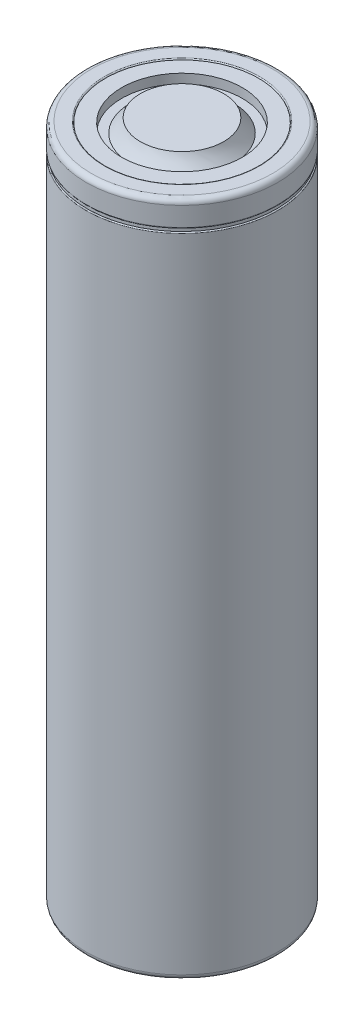
ISO-10303-21;
HEADER;
FILE_DESCRIPTION(('STEP AP214'),'2;1');
FILE_NAME('part.step','',(''),(''),'','','');
FILE_SCHEMA(('AUTOMOTIVE_DESIGN { 1 0 10303 214 1 1 1 1 }'));
ENDSEC;
DATA;
#1=APPLICATION_CONTEXT('core data for automotive mechanical design processes');
#2=APPLICATION_PROTOCOL_DEFINITION('international standard','automotive_design',2000,#1);
#3=PRODUCT_CONTEXT('',#1,'mechanical');
#4=PRODUCT('Part','Part','',(#3));
#5=PRODUCT_RELATED_PRODUCT_CATEGORY('part','',(#4));
#6=PRODUCT_DEFINITION_FORMATION('','',#4);
#7=PRODUCT_DEFINITION_CONTEXT('part definition',#1,'design');
#8=PRODUCT_DEFINITION('design','',#6,#7);
#9=PRODUCT_DEFINITION_SHAPE('','',#8);
#10=(LENGTH_UNIT() NAMED_UNIT(*) SI_UNIT(.MILLI.,.METRE.));
#11=(NAMED_UNIT(*) PLANE_ANGLE_UNIT() SI_UNIT($,.RADIAN.));
#12=(NAMED_UNIT(*) SI_UNIT($,.STERADIAN.) SOLID_ANGLE_UNIT());
#13=UNCERTAINTY_MEASURE_WITH_UNIT(LENGTH_MEASURE(1.E-05),#10,'distance_accuracy_value','');
#14=(GEOMETRIC_REPRESENTATION_CONTEXT(3) GLOBAL_UNCERTAINTY_ASSIGNED_CONTEXT((#13)) GLOBAL_UNIT_ASSIGNED_CONTEXT((#10,
#11,#12)) REPRESENTATION_CONTEXT('',''));
#15=CARTESIAN_POINT('',(0.,0.,0.));
#16=DIRECTION('',(0.,0.,1.));
#17=DIRECTION('',(1.,0.,0.));
#18=AXIS2_PLACEMENT_3D('',#15,#16,#17);
#19=CARTESIAN_POINT('',(0.,64.,0.));
#20=DIRECTION('',(0.,1.,0.));
#21=DIRECTION('',(0.,0.,1.));
#22=AXIS2_PLACEMENT_3D('',#19,#20,#21);
#23=PLANE('',#22);
#24=CARTESIAN_POINT('',(0.,64.,0.));
#25=DIRECTION('',(0.,1.,0.));
#26=DIRECTION('',(0.,0.,1.));
#27=AXIS2_PLACEMENT_3D('',#24,#25,#26);
#28=CIRCLE('',#27,5.8);
#29=CARTESIAN_POINT('',(0.,64.,5.8));
#30=VERTEX_POINT('',#29);
#31=EDGE_CURVE('E300',#30,#30,#28,.T.);
#32=ORIENTED_EDGE('',*,*,#31,.T.);
#33=EDGE_LOOP('',(#32));
#34=FACE_BOUND('',#33,.T.);
#35=CARTESIAN_POINT('',(0.,64.,0.));
#36=DIRECTION('',(0.,1.,0.));
#37=DIRECTION('',(0.,0.,1.));
#38=AXIS2_PLACEMENT_3D('',#35,#36,#37);
#39=CIRCLE('',#38,4.97813872334347);
#40=CARTESIAN_POINT('',(4.8940176038394,64.,0.911294048132539));
#41=VERTEX_POINT('',#40);
#42=EDGE_CURVE('E198',#41,#41,#39,.T.);
#43=ORIENTED_EDGE('',*,*,#42,.F.);
#44=EDGE_LOOP('',(#43));
#45=FACE_BOUND('',#44,.T.);
#46=ADVANCED_FACE('F62',(#34,#45),#23,.T.);
#47=CARTESIAN_POINT('',(0.,65.,0.));
#48=DIRECTION('',(0.,-1.,0.));
#49=DIRECTION('',(0.,0.,-1.));
#50=AXIS2_PLACEMENT_3D('',#47,#48,#49);
#51=CYLINDRICAL_SURFACE('',#50,9.2);
#52=DIRECTION('',(0.,-1.,0.));
#53=VECTOR('',#52,1.);
#54=CARTESIAN_POINT('',(-8.17250775108222,62.56061349589,4.22493988815239));
#55=LINE('',#54,#53);
#56=CARTESIAN_POINT('',(-8.17250775108222,62.66061349589,4.22493988815239));
#57=VERTEX_POINT('',#56);
#58=CARTESIAN_POINT('',(-8.17250775108222,62.1587302341845,4.22493988815239));
#59=VERTEX_POINT('',#58);
#60=EDGE_CURVE('E77',#57,#59,#55,.T.);
#61=ORIENTED_EDGE('',*,*,#60,.F.);
#62=CARTESIAN_POINT('',(0.,62.66061349589,0.));
#63=DIRECTION('',(0.,1.,0.));
#64=DIRECTION('',(0.,0.,1.));
#65=AXIS2_PLACEMENT_3D('',#62,#63,#64);
#66=CIRCLE('',#65,9.2);
#67=CARTESIAN_POINT('',(-8.30255194028113,62.66061349589,3.96328541477068));
#68=VERTEX_POINT('',#67);
#69=EDGE_CURVE('E214',#57,#68,#66,.T.);
#70=ORIENTED_EDGE('',*,*,#69,.T.);
#71=DIRECTION('',(0.,1.,0.));
#72=VECTOR('',#71,1.);
#73=CARTESIAN_POINT('',(-8.30255194028113,62.2587302341845,3.96328541477068));
#74=LINE('',#73,#72);
#75=CARTESIAN_POINT('',(-8.30255194028113,62.1587302341845,3.96328541477068));
#76=VERTEX_POINT('',#75);
#77=EDGE_CURVE('E84',#76,#68,#74,.T.);
#78=ORIENTED_EDGE('',*,*,#77,.F.);
#79=CARTESIAN_POINT('',(0.,62.1587302341845,0.));
#80=DIRECTION('',(0.,-1.,0.));
#81=DIRECTION('',(0.,0.,-1.));
#82=AXIS2_PLACEMENT_3D('',#79,#80,#81);
#83=CIRCLE('',#82,9.2);
#84=EDGE_CURVE('E204',#76,#59,#83,.T.);
#85=ORIENTED_EDGE('',*,*,#84,.T.);
#86=EDGE_LOOP('',(#61,#70,#78,#85));
#87=FACE_BOUND('',#86,.T.);
#88=CARTESIAN_POINT('',(0.,64.5,0.));
#89=DIRECTION('',(0.,1.,0.));
#90=DIRECTION('',(0.,0.,1.));
#91=AXIS2_PLACEMENT_3D('',#88,#89,#90);
#92=CIRCLE('',#91,9.2);
#93=CARTESIAN_POINT('',(0.,64.5,9.2));
#94=VERTEX_POINT('',#93);
#95=EDGE_CURVE('E201',#94,#94,#92,.F.);
#96=ORIENTED_EDGE('',*,*,#95,.T.);
#97=EDGE_LOOP('',(#96));
#98=FACE_BOUND('',#97,.T.);
#99=CARTESIAN_POINT('',(0.,0.5,0.));
#100=DIRECTION('',(0.,1.,0.));
#101=DIRECTION('',(0.,0.,1.));
#102=AXIS2_PLACEMENT_3D('',#99,#100,#101);
#103=CIRCLE('',#102,9.2);
#104=CARTESIAN_POINT('',(0.,0.5,9.2));
#105=VERTEX_POINT('',#104);
#106=EDGE_CURVE('E294',#105,#105,#103,.T.);
#107=ORIENTED_EDGE('',*,*,#106,.T.);
#108=EDGE_LOOP('',(#107));
#109=FACE_BOUND('',#108,.T.);
#110=ADVANCED_FACE('F220',(#87,#98,#109),#51,.T.);
#111=CARTESIAN_POINT('',(0.,65.,0.));
#112=DIRECTION('',(0.,1.,0.));
#113=DIRECTION('',(0.,0.,1.));
#114=AXIS2_PLACEMENT_3D('',#111,#112,#113);
#115=PLANE('',#114);
#116=CARTESIAN_POINT('',(0.,65.,0.));
#117=DIRECTION('',(0.,1.,0.));
#118=DIRECTION('',(0.,0.,1.));
#119=AXIS2_PLACEMENT_3D('',#116,#117,#118);
#120=CIRCLE('',#119,8.7);
#121=CARTESIAN_POINT('',(0.,65.,8.7));
#122=VERTEX_POINT('',#121);
#123=EDGE_CURVE('E282',#122,#122,#120,.T.);
#124=ORIENTED_EDGE('',*,*,#123,.T.);
#125=EDGE_LOOP('',(#124));
#126=FACE_BOUND('',#125,.T.);
#127=CARTESIAN_POINT('',(0.,65.,0.));
#128=DIRECTION('',(0.,1.,0.));
#129=DIRECTION('',(0.,0.,1.));
#130=AXIS2_PLACEMENT_3D('',#127,#128,#129);
#131=CIRCLE('',#130,7.45692507146958);
#132=CARTESIAN_POINT('',(0.,65.,7.45692507146958));
#133=VERTEX_POINT('',#132);
#134=EDGE_CURVE('E283',#133,#133,#131,.F.);
#135=ORIENTED_EDGE('',*,*,#134,.T.);
#136=EDGE_LOOP('',(#135));
#137=FACE_BOUND('',#136,.T.);
#138=ADVANCED_FACE('F241',(#126,#137),#115,.T.);
#139=CARTESIAN_POINT('',(0.,0.,0.));
#140=DIRECTION('',(0.,1.,0.));
#141=DIRECTION('',(0.,0.,1.));
#142=AXIS2_PLACEMENT_3D('',#139,#140,#141);
#143=PLANE('',#142);
#144=CARTESIAN_POINT('',(0.,0.,0.));
#145=DIRECTION('',(0.,1.,0.));
#146=DIRECTION('',(0.,0.,1.));
#147=AXIS2_PLACEMENT_3D('',#144,#145,#146);
#148=CIRCLE('',#147,7.6);
#149=CARTESIAN_POINT('',(0.,0.,7.6));
#150=VERTEX_POINT('',#149);
#151=EDGE_CURVE('E286',#150,#150,#148,.T.);
#152=ORIENTED_EDGE('',*,*,#151,.T.);
#153=EDGE_LOOP('',(#152));
#154=FACE_BOUND('',#153,.T.);
#155=CARTESIAN_POINT('',(0.,0.,0.));
#156=DIRECTION('',(0.,1.,0.));
#157=DIRECTION('',(0.,0.,1.));
#158=AXIS2_PLACEMENT_3D('',#155,#156,#157);
#159=CIRCLE('',#158,8.7);
#160=CARTESIAN_POINT('',(0.,0.,8.7));
#161=VERTEX_POINT('',#160);
#162=EDGE_CURVE('E291',#161,#161,#159,.F.);
#163=ORIENTED_EDGE('',*,*,#162,.T.);
#164=EDGE_LOOP('',(#163));
#165=FACE_BOUND('',#164,.T.);
#166=ADVANCED_FACE('F255',(#154,#165),#143,.F.);
#167=CARTESIAN_POINT('',(0.,0.1,0.));
#168=DIRECTION('',(0.,-1.,0.));
#169=DIRECTION('',(0.,0.,-1.));
#170=AXIS2_PLACEMENT_3D('',#167,#168,#169);
#171=PLANE('',#170);
#172=CARTESIAN_POINT('',(0.,0.1,0.));
#173=DIRECTION('',(0.,-1.,0.));
#174=DIRECTION('',(0.,0.,-1.));
#175=AXIS2_PLACEMENT_3D('',#172,#173,#174);
#176=CIRCLE('',#175,7.5);
#177=CARTESIAN_POINT('',(0.,0.1,-7.5));
#178=VERTEX_POINT('',#177);
#179=EDGE_CURVE('E297',#178,#178,#176,.T.);
#180=ORIENTED_EDGE('',*,*,#179,.T.);
#181=EDGE_LOOP('',(#180));
#182=FACE_BOUND('',#181,.T.);
#183=ADVANCED_FACE('F251',(#182),#171,.T.);
#184=CARTESIAN_POINT('',(0.,0.5,0.));
#185=DIRECTION('',(0.,1.,0.));
#186=DIRECTION('',(0.,0.,1.));
#187=AXIS2_PLACEMENT_3D('',#184,#185,#186);
#188=TOROIDAL_SURFACE('',#187,8.7,0.5);
#189=ORIENTED_EDGE('',*,*,#162,.F.);
#190=EDGE_LOOP('',(#189));
#191=FACE_BOUND('',#190,.T.);
#192=ORIENTED_EDGE('',*,*,#106,.F.);
#193=EDGE_LOOP('',(#192));
#194=FACE_BOUND('',#193,.T.);
#195=ADVANCED_FACE('F254',(#191,#194),#188,.T.);
#196=CARTESIAN_POINT('',(0.,64.9,0.));
#197=DIRECTION('',(0.,1.,0.));
#198=DIRECTION('',(0.,0.,1.));
#199=AXIS2_PLACEMENT_3D('',#196,#197,#198);
#200=PLANE('',#199);
#201=CARTESIAN_POINT('',(0.,64.9,0.));
#202=DIRECTION('',(0.,1.,0.));
#203=DIRECTION('',(0.,0.,1.));
#204=AXIS2_PLACEMENT_3D('',#201,#202,#203);
#205=CIRCLE('',#204,7.35692507146958);
#206=CARTESIAN_POINT('',(0.,64.9,7.35692507146958));
#207=VERTEX_POINT('',#206);
#208=EDGE_CURVE('E305',#207,#207,#205,.T.);
#209=ORIENTED_EDGE('',*,*,#208,.T.);
#210=EDGE_LOOP('',(#209));
#211=FACE_BOUND('',#210,.T.);
#212=CARTESIAN_POINT('',(0.,64.9,0.));
#213=DIRECTION('',(0.,1.,0.));
#214=DIRECTION('',(0.,0.,1.));
#215=AXIS2_PLACEMENT_3D('',#212,#213,#214);
#216=CIRCLE('',#215,5.8);
#217=CARTESIAN_POINT('',(0.,64.9,5.8));
#218=VERTEX_POINT('',#217);
#219=EDGE_CURVE('E302',#218,#218,#216,.F.);
#220=ORIENTED_EDGE('',*,*,#219,.T.);
#221=EDGE_LOOP('',(#220));
#222=FACE_BOUND('',#221,.T.);
#223=ADVANCED_FACE('F184',(#211,#222),#200,.T.);
#224=CARTESIAN_POINT('',(0.,64.,0.));
#225=DIRECTION('',(0.,1.,0.));
#226=DIRECTION('',(0.,0.,1.));
#227=AXIS2_PLACEMENT_3D('',#224,#225,#226);
#228=CYLINDRICAL_SURFACE('',#227,5.8);
#229=ORIENTED_EDGE('',*,*,#31,.F.);
#230=EDGE_LOOP('',(#229));
#231=FACE_BOUND('',#230,.T.);
#232=ORIENTED_EDGE('',*,*,#219,.F.);
#233=EDGE_LOOP('',(#232));
#234=FACE_BOUND('',#233,.T.);
#235=ADVANCED_FACE('F246',(#231,#234),#228,.F.);
#236=CARTESIAN_POINT('',(0.,0.1,0.));
#237=DIRECTION('',(0.,1.,0.));
#238=DIRECTION('',(0.,0.,1.));
#239=AXIS2_PLACEMENT_3D('',#236,#237,#238);
#240=TOROIDAL_SURFACE('',#239,7.6,0.1);
#241=ORIENTED_EDGE('',*,*,#151,.F.);
#242=EDGE_LOOP('',(#241));
#243=FACE_BOUND('',#242,.T.);
#244=ORIENTED_EDGE('',*,*,#179,.F.);
#245=EDGE_LOOP('',(#244));
#246=FACE_BOUND('',#245,.T.);
#247=ADVANCED_FACE('F249',(#243,#246),#240,.T.);
#248=CARTESIAN_POINT('',(0.,64.9,0.));
#249=DIRECTION('',(0.,1.,0.));
#250=DIRECTION('',(0.,0.,1.));
#251=AXIS2_PLACEMENT_3D('',#248,#249,#250);
#252=TOROIDAL_SURFACE('',#251,7.45692507146958,0.1);
#253=ORIENTED_EDGE('',*,*,#134,.F.);
#254=EDGE_LOOP('',(#253));
#255=FACE_BOUND('',#254,.T.);
#256=ORIENTED_EDGE('',*,*,#208,.F.);
#257=EDGE_LOOP('',(#256));
#258=FACE_BOUND('',#257,.T.);
#259=ADVANCED_FACE('F268',(#255,#258),#252,.T.);
#260=CARTESIAN_POINT('',(0.,64.5,0.));
#261=DIRECTION('',(0.,1.,0.));
#262=DIRECTION('',(0.,0.,1.));
#263=AXIS2_PLACEMENT_3D('',#260,#261,#262);
#264=TOROIDAL_SURFACE('',#263,8.7,0.5);
#265=ORIENTED_EDGE('',*,*,#95,.F.);
#266=EDGE_LOOP('',(#265));
#267=FACE_BOUND('',#266,.T.);
#268=ORIENTED_EDGE('',*,*,#123,.F.);
#269=EDGE_LOOP('',(#268));
#270=FACE_BOUND('',#269,.T.);
#271=ADVANCED_FACE('F171',(#267,#270),#264,.T.);
#272=CARTESIAN_POINT('',(4.8940176038394,64.,0.911294048132539));
#273=CARTESIAN_POINT('',(3.33769951309119,65.3,2.2044867793459));
#274=CARTESIAN_POINT('',(6.71660570010448,64.,-8.87674115954626));
#275=CARTESIAN_POINT('',(7.74667307178298,65.3,-4.47091224683648));
#276=CARTESIAN_POINT('',(-3.07142950757432,64.,-10.6993292558113));
#277=CARTESIAN_POINT('',(1.07127404560061,65.3,-8.87988580552827));
#278=CARTESIAN_POINT('',(-4.8940176038394,64.,-0.911294048132539));
#279=CARTESIAN_POINT('',(-3.33769951309119,65.3,-2.2044867793459));
#280=CARTESIAN_POINT('',(-6.71660570010448,64.,8.87674115954626));
#281=CARTESIAN_POINT('',(-7.74667307178298,65.3,4.47091224683648));
#282=CARTESIAN_POINT('',(3.07142950757432,64.,10.6993292558113));
#283=CARTESIAN_POINT('',(-1.07127404560061,65.3,8.87988580552827));
#284=CARTESIAN_POINT('',(4.8940176038394,64.,0.911294048132539));
#285=CARTESIAN_POINT('',(3.33769951309119,65.3,2.2044867793459));
#286=(BOUNDED_SURFACE() B_SPLINE_SURFACE(3,1,((#272,#273),(#274,#275),(#276,#277),(#278,#279),
(#280,#281),(#282,#283),(#284,#285)),.UNSPECIFIED.,.T.,.F.,.F.) B_SPLINE_SURFACE_WITH_KNOTS((4,
3,4),(2,2),(0.,0.5,1.),(0.,1.),
.UNSPECIFIED.) GEOMETRIC_REPRESENTATION_ITEM() RATIONAL_B_SPLINE_SURFACE(((1.,1.),
(0.333333333333333,0.333333333333333),(0.333333333333333,0.333333333333333),(1.,1.),
(0.333333333333333,0.333333333333333),(0.333333333333333,0.333333333333333),(1.,1.))) REPRESENTATION_ITEM('') SURFACE());
#287=CARTESIAN_POINT('',(0.,65.3,0.));
#288=DIRECTION('',(0.,1.,0.));
#289=DIRECTION('',(0.,0.,1.));
#290=AXIS2_PLACEMENT_3D('',#287,#288,#289);
#291=CIRCLE('',#290,4.);
#292=CARTESIAN_POINT('',(3.33769951309119,65.3,2.2044867793459));
#293=VERTEX_POINT('',#292);
#294=EDGE_CURVE('E147',#293,#293,#291,.F.);
#295=CARTESIAN_POINT('',(4.8940176038394,64.,0.911294048132539));
#296=CARTESIAN_POINT('',(4.87780595706078,64.0135416666667,0.924764805749342));
#297=CARTESIAN_POINT('',(4.86159431028215,64.0270833333334,0.938235563366149));
#298=CARTESIAN_POINT('',(4.82917101672489,64.0541666666667,0.965177078599763));
#299=CARTESIAN_POINT('',(4.81295936994626,64.0677083333333,0.97864783621657));
#300=CARTESIAN_POINT('',(4.78053607638901,64.0947916666667,1.00558935145018));
#301=CARTESIAN_POINT('',(4.76432442961038,64.1083333333333,1.01906010906698));
#302=CARTESIAN_POINT('',(4.73190113605313,64.1354166666667,1.0460016243006));
#303=CARTESIAN_POINT('',(4.7156894892745,64.1489583333333,1.0594723819174));
#304=CARTESIAN_POINT('',(4.68326619571724,64.1760416666666,1.08641389715102));
#305=CARTESIAN_POINT('',(4.66705454893862,64.1895833333333,1.09988465476782));
#306=CARTESIAN_POINT('',(4.63463125538136,64.2166666666667,1.12682617000143));
#307=CARTESIAN_POINT('',(4.61841960860274,64.2302083333333,1.14029692761824));
#308=CARTESIAN_POINT('',(4.58599631504548,64.2572916666667,1.16723844285185));
#309=CARTESIAN_POINT('',(4.56978466826686,64.2708333333333,1.18070920046866));
#310=CARTESIAN_POINT('',(4.5373613747096,64.2979166666667,1.20765071570227));
#311=CARTESIAN_POINT('',(4.52114972793097,64.3114583333333,1.22112147331907));
#312=CARTESIAN_POINT('',(4.48872643437372,64.3385416666667,1.24806298855269));
#313=CARTESIAN_POINT('',(4.47251478759509,64.3520833333333,1.26153374616949));
#314=CARTESIAN_POINT('',(4.44009149403784,64.3791666666667,1.2884752614031));
#315=CARTESIAN_POINT('',(4.42387984725921,64.3927083333333,1.30194601901991));
#316=CARTESIAN_POINT('',(4.39145655370196,64.4197916666667,1.32888753425352));
#317=CARTESIAN_POINT('',(4.37524490692333,64.4333333333333,1.34235829187033));
#318=CARTESIAN_POINT('',(4.34282161336608,64.4604166666667,1.36929980710394));
#319=CARTESIAN_POINT('',(4.32660996658745,64.4739583333333,1.38277056472074));
#320=CARTESIAN_POINT('',(4.29418667303019,64.5010416666667,1.40971207995435));
#321=CARTESIAN_POINT('',(4.27797502625156,64.5145833333333,1.42318283757116));
#322=CARTESIAN_POINT('',(4.24555173269431,64.5416666666667,1.45012435280477));
#323=CARTESIAN_POINT('',(4.22934008591569,64.5552083333333,1.46359511042158));
#324=CARTESIAN_POINT('',(4.19691679235843,64.5822916666667,1.49053662565519));
#325=CARTESIAN_POINT('',(4.1807051455798,64.5958333333333,1.504007383272));
#326=CARTESIAN_POINT('',(4.14828185202255,64.6229166666667,1.53094889850561));
#327=CARTESIAN_POINT('',(4.13207020524392,64.6364583333333,1.54441965612241));
#328=CARTESIAN_POINT('',(4.09964691168667,64.6635416666667,1.57136117135602));
#329=CARTESIAN_POINT('',(4.08343526490804,64.6770833333333,1.58483192897283));
#330=CARTESIAN_POINT('',(4.05101197135078,64.7041666666667,1.61177344420644));
#331=CARTESIAN_POINT('',(4.03480032457216,64.7177083333333,1.62524420182325));
#332=CARTESIAN_POINT('',(4.0023770310149,64.7447916666667,1.65218571705686));
#333=CARTESIAN_POINT('',(3.98616538423628,64.7583333333333,1.66565647467366));
#334=CARTESIAN_POINT('',(3.95374209067902,64.7854166666667,1.69259798990728));
#335=CARTESIAN_POINT('',(3.93753044390039,64.7989583333333,1.70606874752408));
#336=CARTESIAN_POINT('',(3.90510715034314,64.8260416666667,1.7330102627577));
#337=CARTESIAN_POINT('',(3.88889550356451,64.8395833333333,1.7464810203745));
#338=CARTESIAN_POINT('',(3.85647221000726,64.8666666666667,1.77342253560811));
#339=CARTESIAN_POINT('',(3.84026056322863,64.8802083333333,1.78689329322492));
#340=CARTESIAN_POINT('',(3.80783726967138,64.9072916666667,1.81383480845853));
#341=CARTESIAN_POINT('',(3.79162562289275,64.9208333333333,1.82730556607534));
#342=CARTESIAN_POINT('',(3.7592023293355,64.9479166666667,1.85424708130895));
#343=CARTESIAN_POINT('',(3.74299068255687,64.9614583333333,1.86771783892575));
#344=CARTESIAN_POINT('',(3.71056738899961,64.9885416666667,1.89465935415936));
#345=CARTESIAN_POINT('',(3.69435574222099,65.0020833333333,1.90813011177617));
#346=CARTESIAN_POINT('',(3.66193244866373,65.0291666666667,1.93507162700978));
#347=CARTESIAN_POINT('',(3.6457208018851,65.0427083333333,1.94854238462659));
#348=CARTESIAN_POINT('',(3.61329750832785,65.0697916666667,1.9754838998602));
#349=CARTESIAN_POINT('',(3.59708586154922,65.0833333333333,1.988954657477));
#350=CARTESIAN_POINT('',(3.56466256799197,65.1104166666667,2.01589617271062));
#351=CARTESIAN_POINT('',(3.54845092121334,65.1239583333333,2.02936693032742));
#352=CARTESIAN_POINT('',(3.51602762765609,65.1510416666667,2.05630844556103));
#353=CARTESIAN_POINT('',(3.49981598087746,65.1645833333333,2.06977920317784));
#354=CARTESIAN_POINT('',(3.46739268732021,65.1916666666667,2.09672071841145));
#355=CARTESIAN_POINT('',(3.45118104054158,65.2052083333333,2.11019147602826));
#356=CARTESIAN_POINT('',(3.41875774698432,65.2322916666667,2.13713299126187));
#357=CARTESIAN_POINT('',(3.4025461002057,65.2458333333333,2.15060374887868));
#358=CARTESIAN_POINT('',(3.37012280664844,65.2729166666667,2.17754526411229));
#359=CARTESIAN_POINT('',(3.35391115986982,65.2864583333333,2.19101602172909));
#360=CARTESIAN_POINT('',(3.33769951309119,65.3,2.2044867793459));
#361=B_SPLINE_CURVE_WITH_KNOTS('',3,(#295,#296,#297,#298,#299,#300,#301,#302,#303,#304,#305,
#306,#307,#308,#309,#310,#311,#312,#313,#314,#315,#316,#317,#318,#319,#320,#321,#322,#323,#324,
#325,#326,#327,#328,#329,#330,#331,#332,#333,#334,#335,#336,#337,#338,#339,#340,#341,#342,#343,
#344,#345,#346,#347,#348,#349,#350,#351,#352,#353,#354,#355,#356,#357,#358,#359,#360),
.UNSPECIFIED.,.F.,.F.,(4,2,2,2,2,2,2,2,2,2,2,2,2,2,2,2,2,2,2,2,2,2,2,2,2,2,2,2,2,2,2,2,4),(0.,
0.0751591634028185,0.150318326805629,0.225477490208455,0.300636653611266,0.375795817014085,
0.450954980416903,0.526114143819721,0.601273307222532,0.676432470625351,0.751591634028169,
0.826750797430987,0.901909960833806,0.977069124236616,1.05222828763944,1.12738745104225,
1.20254661444507,1.27770577784789,1.35286494125071,1.42802410465353,1.50318326805634,
1.57834243145916,1.65350159486197,1.72866075826479,1.80381992166761,1.87897908507042,
1.95413824847324,2.02929741187606,2.10445657527887,2.1796157386817,2.25477490208451,
2.32993406548733,2.40509322889014),.UNSPECIFIED.);
#362=EDGE_CURVE('BSEAM158',#41,#293,#361,.T.);
#363=ORIENTED_EDGE('',*,*,#42,.T.);
#364=ORIENTED_EDGE('',*,*,#294,.T.);
#365=ORIENTED_EDGE('',*,*,#362,.T.);
#366=ORIENTED_EDGE('',*,*,#362,.F.);
#367=EDGE_LOOP('',(#363,#365,#364,#366));
#368=FACE_BOUND('',#367,.T.);
#369=ADVANCED_FACE('F158',(#368),#286,.T.);
#370=CARTESIAN_POINT('',(0.,65.3,0.));
#371=DIRECTION('',(0.,1.,0.));
#372=DIRECTION('',(0.,0.,1.));
#373=AXIS2_PLACEMENT_3D('',#370,#371,#372);
#374=PLANE('',#373);
#375=ORIENTED_EDGE('',*,*,#294,.F.);
#376=EDGE_LOOP('',(#375));
#377=FACE_BOUND('',#376,.T.);
#378=ADVANCED_FACE('F170',(#377),#374,.T.);
#379=CARTESIAN_POINT('',(0.,0.,0.));
#380=DIRECTION('',(-0.430791892909858,0.,-0.902451297856644));
#381=DIRECTION('',(-0.902451297856644,0.,0.430791892909858));
#382=AXIS2_PLACEMENT_3D('',#379,#380,#381);
#383=PLANE('',#382);
#384=ORIENTED_EDGE('',*,*,#77,.T.);
#385=CARTESIAN_POINT('',(-8.21230681049546,62.66061349589,3.92020622547971));
#386=DIRECTION('',(-0.430791892909858,0.,-0.902451297856644));
#387=DIRECTION('',(-0.902451297856644,0.,0.430791892909858));
#388=AXIS2_PLACEMENT_3D('',#385,#386,#387);
#389=CIRCLE('',#388,0.1);
#390=CARTESIAN_POINT('',(-8.21230681049547,62.56061349589,3.9202062254797));
#391=VERTEX_POINT('',#390);
#392=EDGE_CURVE('E13',#68,#391,#389,.F.);
#393=ORIENTED_EDGE('',*,*,#392,.T.);
#394=DIRECTION('',(0.902451297856644,0.,-0.430791892909858));
#395=VECTOR('',#394,1.);
#396=CARTESIAN_POINT('',(-8.30255194028113,62.56061349589,3.96328541477068));
#397=LINE('',#396,#395);
#398=CARTESIAN_POINT('',(-8.21128007103699,62.56061349589,3.9197161037015));
#399=VERTEX_POINT('',#398);
#400=EDGE_CURVE('E113',#391,#399,#397,.T.);
#401=ORIENTED_EDGE('',*,*,#400,.T.);
#402=DIRECTION('',(0.,-1.,0.));
#403=VECTOR('',#402,1.);
#404=CARTESIAN_POINT('',(-8.21128007103699,62.56061349589,3.9197161037015));
#405=LINE('',#404,#403);
#406=CARTESIAN_POINT('',(-8.21128007103699,62.2587302341845,3.9197161037015));
#407=VERTEX_POINT('',#406);
#408=EDGE_CURVE('E117',#399,#407,#405,.T.);
#409=ORIENTED_EDGE('',*,*,#408,.T.);
#410=DIRECTION('',(-0.902451297856644,0.,0.430791892909858));
#411=VECTOR('',#410,1.);
#412=CARTESIAN_POINT('',(-8.21128007103699,62.2587302341845,3.9197161037015));
#413=LINE('',#412,#411);
#414=CARTESIAN_POINT('',(-8.21230681049547,62.2587302341845,3.9202062254797));
#415=VERTEX_POINT('',#414);
#416=EDGE_CURVE('E131',#407,#415,#413,.T.);
#417=ORIENTED_EDGE('',*,*,#416,.T.);
#418=CARTESIAN_POINT('',(-8.21230681049546,62.1587302341845,3.92020622547971));
#419=DIRECTION('',(-0.430791892909858,0.,-0.902451297856644));
#420=DIRECTION('',(-0.902451297856644,0.,0.430791892909858));
#421=AXIS2_PLACEMENT_3D('',#418,#419,#420);
#422=CIRCLE('',#421,0.1);
#423=EDGE_CURVE('E210',#415,#76,#422,.F.);
#424=ORIENTED_EDGE('',*,*,#423,.T.);
#425=EDGE_LOOP('',(#384,#393,#401,#409,#417,#424));
#426=FACE_BOUND('',#425,.T.);
#427=ADVANCED_FACE('F115',(#426),#383,.T.);
#428=CARTESIAN_POINT('',(0.,0.,0.));
#429=DIRECTION('',(-0.459232596538304,0.,-0.88831605990024));
#430=DIRECTION('',(-0.88831605990024,0.,0.459232596538304));
#431=AXIS2_PLACEMENT_3D('',#428,#429,#430);
#432=PLANE('',#431);
#433=ORIENTED_EDGE('',*,*,#60,.T.);
#434=CARTESIAN_POINT('',(-8.08367614509219,62.1587302341845,4.17901662849856));
#435=DIRECTION('',(-0.459232596538304,0.,-0.88831605990024));
#436=DIRECTION('',(-0.88831605990024,0.,0.459232596538304));
#437=AXIS2_PLACEMENT_3D('',#434,#435,#436);
#438=CIRCLE('',#437,0.1);
#439=CARTESIAN_POINT('',(-8.08367614509219,62.2587302341845,4.17901662849856));
#440=VERTEX_POINT('',#439);
#441=EDGE_CURVE('E208',#59,#440,#438,.T.);
#442=ORIENTED_EDGE('',*,*,#441,.T.);
#443=DIRECTION('',(-0.88831605990024,0.,0.459232596538304));
#444=VECTOR('',#443,1.);
#445=CARTESIAN_POINT('',(-8.08266548761687,62.2587302341845,4.1784941490821));
#446=LINE('',#445,#444);
#447=CARTESIAN_POINT('',(-8.08266548761687,62.2587302341845,4.1784941490821));
#448=VERTEX_POINT('',#447);
#449=EDGE_CURVE('E143',#448,#440,#446,.T.);
#450=ORIENTED_EDGE('',*,*,#449,.F.);
#451=DIRECTION('',(0.,-1.,0.));
#452=VECTOR('',#451,1.);
#453=CARTESIAN_POINT('',(-8.08266548761687,62.56061349589,4.1784941490821));
#454=LINE('',#453,#452);
#455=CARTESIAN_POINT('',(-8.08266548761687,62.56061349589,4.1784941490821));
#456=VERTEX_POINT('',#455);
#457=EDGE_CURVE('E137',#456,#448,#454,.T.);
#458=ORIENTED_EDGE('',*,*,#457,.F.);
#459=DIRECTION('',(0.88831605990024,0.,-0.459232596538304));
#460=VECTOR('',#459,1.);
#461=CARTESIAN_POINT('',(-8.17250775108222,62.56061349589,4.22493988815239));
#462=LINE('',#461,#460);
#463=CARTESIAN_POINT('',(-8.08367614509219,62.56061349589,4.17901662849856));
#464=VERTEX_POINT('',#463);
#465=EDGE_CURVE('E135',#464,#456,#462,.T.);
#466=ORIENTED_EDGE('',*,*,#465,.F.);
#467=CARTESIAN_POINT('',(-8.08367614509219,62.66061349589,4.17901662849856));
#468=DIRECTION('',(-0.459232596538304,0.,-0.88831605990024));
#469=DIRECTION('',(-0.88831605990024,0.,0.459232596538304));
#470=AXIS2_PLACEMENT_3D('',#467,#468,#469);
#471=CIRCLE('',#470,0.1);
#472=EDGE_CURVE('E70',#464,#57,#471,.T.);
#473=ORIENTED_EDGE('',*,*,#472,.T.);
#474=EDGE_LOOP('',(#433,#442,#450,#458,#466,#473));
#475=FACE_BOUND('',#474,.T.);
#476=ADVANCED_FACE('F217',(#475),#432,.F.);
#477=CARTESIAN_POINT('',(-8.30255194028113,62.56061349589,3.96328541477068));
#478=DIRECTION('',(0.,1.,0.));
#479=DIRECTION('',(0.,0.,1.));
#480=AXIS2_PLACEMENT_3D('',#477,#478,#479);
#481=PLANE('',#480);
#482=ORIENTED_EDGE('',*,*,#400,.F.);
#483=CARTESIAN_POINT('',(0.,62.56061349589,0.));
#484=DIRECTION('',(0.,1.,0.));
#485=DIRECTION('',(0.,0.,1.));
#486=AXIS2_PLACEMENT_3D('',#483,#484,#485);
#487=CIRCLE('',#486,9.1);
#488=EDGE_CURVE('E212',#391,#464,#487,.F.);
#489=ORIENTED_EDGE('',*,*,#488,.T.);
#490=ORIENTED_EDGE('',*,*,#465,.T.);
#491=CARTESIAN_POINT('',(0.,62.56061349589,0.));
#492=DIRECTION('',(0.,-1.,0.));
#493=DIRECTION('',(-0.902451297856645,0.,0.430791892909857));
#494=AXIS2_PLACEMENT_3D('',#491,#492,#493);
#495=CIRCLE('',#494,9.09886227715456);
#496=EDGE_CURVE('E128',#399,#456,#495,.T.);
#497=ORIENTED_EDGE('',*,*,#496,.F.);
#498=EDGE_LOOP('',(#482,#489,#490,#497));
#499=FACE_BOUND('',#498,.T.);
#500=ADVANCED_FACE('F133',(#499),#481,.F.);
#501=CARTESIAN_POINT('',(0.,62.56061349589,0.));
#502=DIRECTION('',(0.,-1.,0.));
#503=DIRECTION('',(0.,0.,-1.));
#504=AXIS2_PLACEMENT_3D('',#501,#502,#503);
#505=CYLINDRICAL_SURFACE('',#504,9.09886227715456);
#506=CARTESIAN_POINT('',(0.,62.2587302341845,0.));
#507=DIRECTION('',(0.,-1.,0.));
#508=DIRECTION('',(-0.902451297856645,0.,0.430791892909857));
#509=AXIS2_PLACEMENT_3D('',#506,#507,#508);
#510=CIRCLE('',#509,9.09886227715456);
#511=EDGE_CURVE('E130',#407,#448,#510,.T.);
#512=ORIENTED_EDGE('',*,*,#511,.F.);
#513=ORIENTED_EDGE('',*,*,#408,.F.);
#514=ORIENTED_EDGE('',*,*,#496,.T.);
#515=ORIENTED_EDGE('',*,*,#457,.T.);
#516=EDGE_LOOP('',(#512,#513,#514,#515));
#517=FACE_BOUND('',#516,.T.);
#518=ADVANCED_FACE('F127',(#517),#505,.T.);
#519=CARTESIAN_POINT('',(-8.21128007103699,62.2587302341845,3.9197161037015));
#520=DIRECTION('',(0.,-1.,0.));
#521=DIRECTION('',(0.,0.,-1.));
#522=AXIS2_PLACEMENT_3D('',#519,#520,#521);
#523=PLANE('',#522);
#524=ORIENTED_EDGE('',*,*,#449,.T.);
#525=CARTESIAN_POINT('',(0.,62.2587302341845,0.));
#526=DIRECTION('',(0.,-1.,0.));
#527=DIRECTION('',(0.,0.,-1.));
#528=AXIS2_PLACEMENT_3D('',#525,#526,#527);
#529=CIRCLE('',#528,9.1);
#530=EDGE_CURVE('E206',#440,#415,#529,.F.);
#531=ORIENTED_EDGE('',*,*,#530,.T.);
#532=ORIENTED_EDGE('',*,*,#416,.F.);
#533=ORIENTED_EDGE('',*,*,#511,.T.);
#534=EDGE_LOOP('',(#524,#531,#532,#533));
#535=FACE_BOUND('',#534,.T.);
#536=ADVANCED_FACE('F183',(#535),#523,.F.);
#537=CARTESIAN_POINT('',(0.,62.1587302341845,0.));
#538=DIRECTION('',(0.,-1.,0.));
#539=DIRECTION('',(0.,0.,-1.));
#540=AXIS2_PLACEMENT_3D('',#537,#538,#539);
#541=TOROIDAL_SURFACE('',#540,9.1,0.1);
#542=ORIENTED_EDGE('',*,*,#423,.F.);
#543=ORIENTED_EDGE('',*,*,#530,.F.);
#544=ORIENTED_EDGE('',*,*,#441,.F.);
#545=ORIENTED_EDGE('',*,*,#84,.F.);
#546=EDGE_LOOP('',(#542,#543,#544,#545));
#547=FACE_BOUND('',#546,.T.);
#548=ADVANCED_FACE('F226',(#547),#541,.T.);
#549=CARTESIAN_POINT('',(0.,62.66061349589,0.));
#550=DIRECTION('',(0.,1.,0.));
#551=DIRECTION('',(0.,0.,1.));
#552=AXIS2_PLACEMENT_3D('',#549,#550,#551);
#553=TOROIDAL_SURFACE('',#552,9.1,0.1);
#554=ORIENTED_EDGE('',*,*,#392,.F.);
#555=ORIENTED_EDGE('',*,*,#69,.F.);
#556=ORIENTED_EDGE('',*,*,#472,.F.);
#557=ORIENTED_EDGE('',*,*,#488,.F.);
#558=EDGE_LOOP('',(#554,#555,#556,#557));
#559=FACE_BOUND('',#558,.T.);
#560=ADVANCED_FACE('F64',(#559),#553,.T.);
#561=CLOSED_SHELL('',(#46,#110,#138,#166,#183,#195,#223,#235,#247,#259,#271,#369,#378,#427,#476,
#500,#518,#536,#548,#560));
#562=MANIFOLD_SOLID_BREP('B2',#561);
#563=ADVANCED_BREP_SHAPE_REPRESENTATION('',(#18,#562),#14);
#564=SHAPE_DEFINITION_REPRESENTATION(#9,#563);
ENDSEC;
END-ISO-10303-21;
